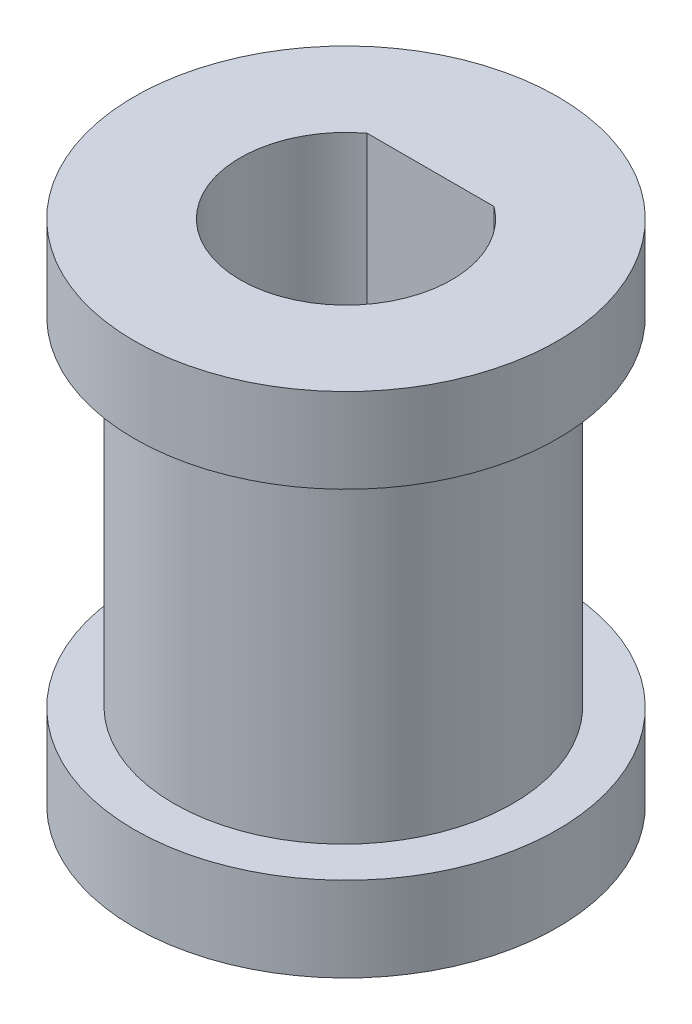
ISO-10303-21;
HEADER;
FILE_DESCRIPTION(('STEP AP214'),'2;1');
FILE_NAME('part.step','',(''),(''),'','','');
FILE_SCHEMA(('AUTOMOTIVE_DESIGN { 1 0 10303 214 1 1 1 1 }'));
ENDSEC;
DATA;
#1=APPLICATION_CONTEXT('core data for automotive mechanical design processes');
#2=APPLICATION_PROTOCOL_DEFINITION('international standard','automotive_design',2000,#1);
#3=PRODUCT_CONTEXT('',#1,'mechanical');
#4=PRODUCT('Part','Part','',(#3));
#5=PRODUCT_RELATED_PRODUCT_CATEGORY('part','',(#4));
#6=PRODUCT_DEFINITION_FORMATION('','',#4);
#7=PRODUCT_DEFINITION_CONTEXT('part definition',#1,'design');
#8=PRODUCT_DEFINITION('design','',#6,#7);
#9=PRODUCT_DEFINITION_SHAPE('','',#8);
#10=(LENGTH_UNIT() NAMED_UNIT(*) SI_UNIT(.MILLI.,.METRE.));
#11=(NAMED_UNIT(*) PLANE_ANGLE_UNIT() SI_UNIT($,.RADIAN.));
#12=(NAMED_UNIT(*) SI_UNIT($,.STERADIAN.) SOLID_ANGLE_UNIT());
#13=UNCERTAINTY_MEASURE_WITH_UNIT(LENGTH_MEASURE(1.E-05),#10,'distance_accuracy_value','');
#14=(GEOMETRIC_REPRESENTATION_CONTEXT(3) GLOBAL_UNCERTAINTY_ASSIGNED_CONTEXT((#13)) GLOBAL_UNIT_ASSIGNED_CONTEXT((#10,
#11,#12)) REPRESENTATION_CONTEXT('',''));
#15=CARTESIAN_POINT('',(0.,0.,0.));
#16=DIRECTION('',(0.,0.,1.));
#17=DIRECTION('',(1.,0.,0.));
#18=AXIS2_PLACEMENT_3D('',#15,#16,#17);
#19=CARTESIAN_POINT('',(0.,10.,-2.));
#20=DIRECTION('',(0.,0.,-1.));
#21=DIRECTION('',(-1.,0.,0.));
#22=AXIS2_PLACEMENT_3D('',#19,#20,#21);
#23=PLANE('',#22);
#24=DIRECTION('',(0.,-1.,0.));
#25=VECTOR('',#24,1.);
#26=CARTESIAN_POINT('',(-1.5,10.,-2.));
#27=LINE('',#26,#25);
#28=CARTESIAN_POINT('',(-1.5,12.,-2.));
#29=VERTEX_POINT('',#28);
#30=CARTESIAN_POINT('',(-1.5,0.,-2.));
#31=VERTEX_POINT('',#30);
#32=EDGE_CURVE('E42',#29,#31,#27,.T.);
#33=ORIENTED_EDGE('',*,*,#32,.T.);
#34=DIRECTION('',(1.,0.,0.));
#35=VECTOR('',#34,1.);
#36=CARTESIAN_POINT('',(0.,0.,-2.));
#37=LINE('',#36,#35);
#38=CARTESIAN_POINT('',(1.5,0.,-2.));
#39=VERTEX_POINT('',#38);
#40=EDGE_CURVE('E86',#31,#39,#37,.T.);
#41=ORIENTED_EDGE('',*,*,#40,.T.);
#42=DIRECTION('',(0.,-1.,0.));
#43=VECTOR('',#42,1.);
#44=CARTESIAN_POINT('',(1.5,10.,-2.));
#45=LINE('',#44,#43);
#46=CARTESIAN_POINT('',(1.5,12.,-2.));
#47=VERTEX_POINT('',#46);
#48=EDGE_CURVE('E11',#47,#39,#45,.T.);
#49=ORIENTED_EDGE('',*,*,#48,.F.);
#50=DIRECTION('',(-1.,0.,0.));
#51=VECTOR('',#50,1.);
#52=CARTESIAN_POINT('',(-1.5,12.,-2.));
#53=LINE('',#52,#51);
#54=EDGE_CURVE('E66',#47,#29,#53,.T.);
#55=ORIENTED_EDGE('',*,*,#54,.T.);
#56=EDGE_LOOP('',(#33,#41,#49,#55));
#57=FACE_BOUND('',#56,.T.);
#58=ADVANCED_FACE('F34',(#57),#23,.F.);
#59=CARTESIAN_POINT('',(0.,10.,0.));
#60=DIRECTION('',(0.,-1.,0.));
#61=DIRECTION('',(0.,0.,-1.));
#62=AXIS2_PLACEMENT_3D('',#59,#60,#61);
#63=CYLINDRICAL_SURFACE('',#62,2.5);
#64=ORIENTED_EDGE('',*,*,#48,.T.);
#65=CARTESIAN_POINT('',(0.,0.,0.));
#66=DIRECTION('',(0.,1.,0.));
#67=DIRECTION('',(0.,0.,1.));
#68=AXIS2_PLACEMENT_3D('',#65,#66,#67);
#69=CIRCLE('',#68,2.5);
#70=EDGE_CURVE('E63',#31,#39,#69,.T.);
#71=ORIENTED_EDGE('',*,*,#70,.F.);
#72=ORIENTED_EDGE('',*,*,#32,.F.);
#73=CARTESIAN_POINT('',(0.,12.,0.));
#74=DIRECTION('',(0.,1.,0.));
#75=DIRECTION('',(0.,0.,1.));
#76=AXIS2_PLACEMENT_3D('',#73,#74,#75);
#77=CIRCLE('',#76,2.5);
#78=EDGE_CURVE('E60',#29,#47,#77,.T.);
#79=ORIENTED_EDGE('',*,*,#78,.T.);
#80=EDGE_LOOP('',(#64,#71,#72,#79));
#81=FACE_BOUND('',#80,.T.);
#82=ADVANCED_FACE('F58',(#81),#63,.F.);
#83=CARTESIAN_POINT('',(-0.0630059120897523,10.,0.));
#84=DIRECTION('',(0.,-1.,0.));
#85=DIRECTION('',(0.,0.,-1.));
#86=AXIS2_PLACEMENT_3D('',#83,#84,#85);
#87=CYLINDRICAL_SURFACE('',#86,4.);
#88=CARTESIAN_POINT('',(-0.0630059120897523,2.,0.));
#89=DIRECTION('',(0.,1.,0.));
#90=DIRECTION('',(0.,0.,1.));
#91=AXIS2_PLACEMENT_3D('',#88,#89,#90);
#92=CIRCLE('',#91,4.);
#93=CARTESIAN_POINT('',(-0.0630059120897523,2.,4.));
#94=VERTEX_POINT('',#93);
#95=EDGE_CURVE('E37',#94,#94,#92,.T.);
#96=ORIENTED_EDGE('',*,*,#95,.T.);
#97=EDGE_LOOP('',(#96));
#98=FACE_BOUND('',#97,.T.);
#99=CARTESIAN_POINT('',(-0.0630059120897523,10.,0.));
#100=DIRECTION('',(0.,1.,0.));
#101=DIRECTION('',(0.,0.,1.));
#102=AXIS2_PLACEMENT_3D('',#99,#100,#101);
#103=CIRCLE('',#102,4.);
#104=CARTESIAN_POINT('',(-0.0630059120897523,10.,4.));
#105=VERTEX_POINT('',#104);
#106=EDGE_CURVE('E64',#105,#105,#103,.T.);
#107=ORIENTED_EDGE('',*,*,#106,.F.);
#108=EDGE_LOOP('',(#107));
#109=FACE_BOUND('',#108,.T.);
#110=ADVANCED_FACE('F93',(#98,#109),#87,.T.);
#111=CARTESIAN_POINT('',(0.,0.,0.));
#112=DIRECTION('',(0.,1.,0.));
#113=DIRECTION('',(0.,0.,1.));
#114=AXIS2_PLACEMENT_3D('',#111,#112,#113);
#115=PLANE('',#114);
#116=ORIENTED_EDGE('',*,*,#40,.F.);
#117=ORIENTED_EDGE('',*,*,#70,.T.);
#118=EDGE_LOOP('',(#116,#117));
#119=FACE_BOUND('',#118,.T.);
#120=CARTESIAN_POINT('',(0.,0.,0.));
#121=DIRECTION('',(0.,1.,0.));
#122=DIRECTION('',(0.,0.,1.));
#123=AXIS2_PLACEMENT_3D('',#120,#121,#122);
#124=CIRCLE('',#123,5.);
#125=CARTESIAN_POINT('',(0.,0.,5.));
#126=VERTEX_POINT('',#125);
#127=EDGE_CURVE('E76',#126,#126,#124,.T.);
#128=ORIENTED_EDGE('',*,*,#127,.F.);
#129=EDGE_LOOP('',(#128));
#130=FACE_BOUND('',#129,.T.);
#131=ADVANCED_FACE('F89',(#119,#130),#115,.F.);
#132=CARTESIAN_POINT('',(0.,2.,0.));
#133=DIRECTION('',(0.,1.,0.));
#134=DIRECTION('',(0.,0.,1.));
#135=AXIS2_PLACEMENT_3D('',#132,#133,#134);
#136=PLANE('',#135);
#137=ORIENTED_EDGE('',*,*,#95,.F.);
#138=EDGE_LOOP('',(#137));
#139=FACE_BOUND('',#138,.T.);
#140=CARTESIAN_POINT('',(0.,2.,0.));
#141=DIRECTION('',(0.,1.,0.));
#142=DIRECTION('',(0.,0.,1.));
#143=AXIS2_PLACEMENT_3D('',#140,#141,#142);
#144=CIRCLE('',#143,5.);
#145=CARTESIAN_POINT('',(0.,2.,5.));
#146=VERTEX_POINT('',#145);
#147=EDGE_CURVE('E79',#146,#146,#144,.T.);
#148=ORIENTED_EDGE('',*,*,#147,.T.);
#149=EDGE_LOOP('',(#148));
#150=FACE_BOUND('',#149,.T.);
#151=ADVANCED_FACE('F92',(#139,#150),#136,.T.);
#152=CARTESIAN_POINT('',(0.,2.,0.));
#153=DIRECTION('',(0.,-1.,0.));
#154=DIRECTION('',(0.,0.,-1.));
#155=AXIS2_PLACEMENT_3D('',#152,#153,#154);
#156=CYLINDRICAL_SURFACE('',#155,5.);
#157=ORIENTED_EDGE('',*,*,#147,.F.);
#158=EDGE_LOOP('',(#157));
#159=FACE_BOUND('',#158,.T.);
#160=ORIENTED_EDGE('',*,*,#127,.T.);
#161=EDGE_LOOP('',(#160));
#162=FACE_BOUND('',#161,.T.);
#163=ADVANCED_FACE('F97',(#159,#162),#156,.T.);
#164=CARTESIAN_POINT('',(0.,12.,0.));
#165=DIRECTION('',(0.,1.,0.));
#166=DIRECTION('',(0.,0.,1.));
#167=AXIS2_PLACEMENT_3D('',#164,#165,#166);
#168=PLANE('',#167);
#169=CARTESIAN_POINT('',(0.,12.,0.));
#170=DIRECTION('',(0.,1.,0.));
#171=DIRECTION('',(0.,0.,1.));
#172=AXIS2_PLACEMENT_3D('',#169,#170,#171);
#173=CIRCLE('',#172,5.);
#174=CARTESIAN_POINT('',(0.,12.,5.));
#175=VERTEX_POINT('',#174);
#176=EDGE_CURVE('E73',#175,#175,#173,.T.);
#177=ORIENTED_EDGE('',*,*,#176,.T.);
#178=EDGE_LOOP('',(#177));
#179=FACE_BOUND('',#178,.T.);
#180=ORIENTED_EDGE('',*,*,#54,.F.);
#181=ORIENTED_EDGE('',*,*,#78,.F.);
#182=EDGE_LOOP('',(#180,#181));
#183=FACE_BOUND('',#182,.T.);
#184=ADVANCED_FACE('F70',(#179,#183),#168,.T.);
#185=CARTESIAN_POINT('',(0.,10.,0.));
#186=DIRECTION('',(0.,1.,0.));
#187=DIRECTION('',(0.,0.,1.));
#188=AXIS2_PLACEMENT_3D('',#185,#186,#187);
#189=PLANE('',#188);
#190=ORIENTED_EDGE('',*,*,#106,.T.);
#191=EDGE_LOOP('',(#190));
#192=FACE_BOUND('',#191,.T.);
#193=CARTESIAN_POINT('',(0.,10.,0.));
#194=DIRECTION('',(0.,1.,0.));
#195=DIRECTION('',(0.,0.,1.));
#196=AXIS2_PLACEMENT_3D('',#193,#194,#195);
#197=CIRCLE('',#196,5.);
#198=CARTESIAN_POINT('',(0.,10.,5.));
#199=VERTEX_POINT('',#198);
#200=EDGE_CURVE('E68',#199,#199,#197,.T.);
#201=ORIENTED_EDGE('',*,*,#200,.F.);
#202=EDGE_LOOP('',(#201));
#203=FACE_BOUND('',#202,.T.);
#204=ADVANCED_FACE('F105',(#192,#203),#189,.F.);
#205=CARTESIAN_POINT('',(0.,12.,0.));
#206=DIRECTION('',(0.,-1.,0.));
#207=DIRECTION('',(0.,0.,-1.));
#208=AXIS2_PLACEMENT_3D('',#205,#206,#207);
#209=CYLINDRICAL_SURFACE('',#208,5.);
#210=ORIENTED_EDGE('',*,*,#176,.F.);
#211=EDGE_LOOP('',(#210));
#212=FACE_BOUND('',#211,.T.);
#213=ORIENTED_EDGE('',*,*,#200,.T.);
#214=EDGE_LOOP('',(#213));
#215=FACE_BOUND('',#214,.T.);
#216=ADVANCED_FACE('F129',(#212,#215),#209,.T.);
#217=CLOSED_SHELL('',(#58,#82,#110,#131,#151,#163,#184,#204,#216));
#218=MANIFOLD_SOLID_BREP('B2',#217);
#219=ADVANCED_BREP_SHAPE_REPRESENTATION('',(#18,#218),#14);
#220=SHAPE_DEFINITION_REPRESENTATION(#9,#219);
ENDSEC;
END-ISO-10303-21;
